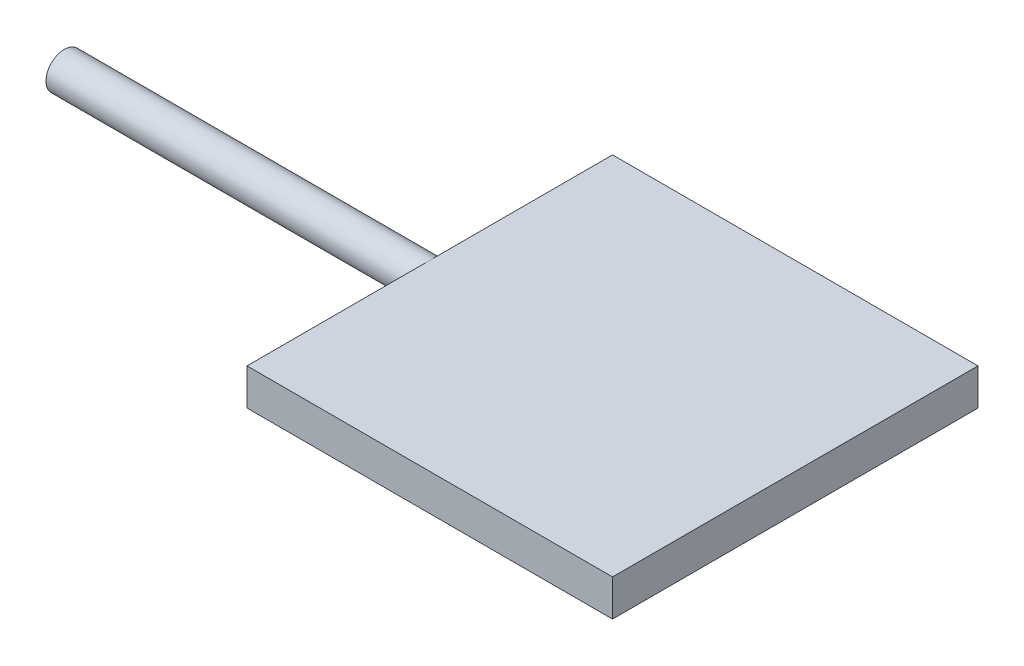
ISO-10303-21;
HEADER;
FILE_DESCRIPTION(('STEP AP214'),'2;1');
FILE_NAME('part.step','',(''),(''),'','','');
FILE_SCHEMA(('AUTOMOTIVE_DESIGN { 1 0 10303 214 1 1 1 1 }'));
ENDSEC;
DATA;
#1=APPLICATION_CONTEXT('core data for automotive mechanical design processes');
#2=APPLICATION_PROTOCOL_DEFINITION('international standard','automotive_design',2000,#1);
#3=PRODUCT_CONTEXT('',#1,'mechanical');
#4=PRODUCT('Part','Part','',(#3));
#5=PRODUCT_RELATED_PRODUCT_CATEGORY('part','',(#4));
#6=PRODUCT_DEFINITION_FORMATION('','',#4);
#7=PRODUCT_DEFINITION_CONTEXT('part definition',#1,'design');
#8=PRODUCT_DEFINITION('design','',#6,#7);
#9=PRODUCT_DEFINITION_SHAPE('','',#8);
#10=(LENGTH_UNIT() NAMED_UNIT(*) SI_UNIT(.MILLI.,.METRE.));
#11=(NAMED_UNIT(*) PLANE_ANGLE_UNIT() SI_UNIT($,.RADIAN.));
#12=(NAMED_UNIT(*) SI_UNIT($,.STERADIAN.) SOLID_ANGLE_UNIT());
#13=UNCERTAINTY_MEASURE_WITH_UNIT(LENGTH_MEASURE(1.E-05),#10,'distance_accuracy_value','');
#14=(GEOMETRIC_REPRESENTATION_CONTEXT(3) GLOBAL_UNCERTAINTY_ASSIGNED_CONTEXT((#13)) GLOBAL_UNIT_ASSIGNED_CONTEXT((#10,
#11,#12)) REPRESENTATION_CONTEXT('',''));
#15=CARTESIAN_POINT('',(0.,0.,0.));
#16=DIRECTION('',(0.,0.,1.));
#17=DIRECTION('',(1.,0.,0.));
#18=AXIS2_PLACEMENT_3D('',#15,#16,#17);
#19=CARTESIAN_POINT('',(0.,10.,0.));
#20=DIRECTION('',(1.,0.,0.));
#21=DIRECTION('',(0.,0.,-1.));
#22=AXIS2_PLACEMENT_3D('',#19,#20,#21);
#23=PLANE('',#22);
#24=CARTESIAN_POINT('',(0.,5.,-50.));
#25=DIRECTION('',(-1.,0.,0.));
#26=DIRECTION('',(0.,0.,1.));
#27=AXIS2_PLACEMENT_3D('',#24,#25,#26);
#28=CIRCLE('',#27,5.);
#29=CARTESIAN_POINT('',(0.,10.,-50.));
#30=VERTEX_POINT('',#29);
#31=CARTESIAN_POINT('',(0.,0.,-50.));
#32=VERTEX_POINT('',#31);
#33=EDGE_CURVE('E43',#30,#32,#28,.T.);
#34=ORIENTED_EDGE('',*,*,#33,.F.);
#35=DIRECTION('',(0.,0.,1.));
#36=VECTOR('',#35,1.);
#37=CARTESIAN_POINT('',(0.,10.,0.));
#38=LINE('',#37,#36);
#39=CARTESIAN_POINT('',(0.,10.,-100.));
#40=VERTEX_POINT('',#39);
#41=EDGE_CURVE('E86',#40,#30,#38,.T.);
#42=ORIENTED_EDGE('',*,*,#41,.F.);
#43=DIRECTION('',(0.,-1.,0.));
#44=VECTOR('',#43,1.);
#45=CARTESIAN_POINT('',(0.,10.,-100.));
#46=LINE('',#45,#44);
#47=CARTESIAN_POINT('',(0.,0.,-100.));
#48=VERTEX_POINT('',#47);
#49=EDGE_CURVE('E197',#40,#48,#46,.T.);
#50=ORIENTED_EDGE('',*,*,#49,.T.);
#51=DIRECTION('',(0.,0.,1.));
#52=VECTOR('',#51,1.);
#53=CARTESIAN_POINT('',(0.,0.,0.));
#54=LINE('',#53,#52);
#55=EDGE_CURVE('E97',#48,#32,#54,.T.);
#56=ORIENTED_EDGE('',*,*,#55,.T.);
#57=EDGE_LOOP('',(#34,#42,#50,#56));
#58=FACE_BOUND('',#57,.T.);
#59=ADVANCED_FACE('F33',(#58),#23,.F.);
#60=EDGE_CURVE('E11',#32,#30,#28,.T.);
#61=ORIENTED_EDGE('',*,*,#60,.F.);
#62=CARTESIAN_POINT('',(0.,0.,0.));
#63=VERTEX_POINT('',#62);
#64=EDGE_CURVE('E202',#32,#63,#54,.T.);
#65=ORIENTED_EDGE('',*,*,#64,.T.);
#66=DIRECTION('',(0.,-1.,0.));
#67=VECTOR('',#66,1.);
#68=CARTESIAN_POINT('',(0.,10.,0.));
#69=LINE('',#68,#67);
#70=CARTESIAN_POINT('',(0.,10.,0.));
#71=VERTEX_POINT('',#70);
#72=EDGE_CURVE('E37',#71,#63,#69,.T.);
#73=ORIENTED_EDGE('',*,*,#72,.F.);
#74=EDGE_CURVE('E82',#30,#71,#38,.T.);
#75=ORIENTED_EDGE('',*,*,#74,.F.);
#76=EDGE_LOOP('',(#61,#65,#73,#75));
#77=FACE_BOUND('',#76,.T.);
#78=ADVANCED_FACE('F35',(#77),#23,.F.);
#79=CARTESIAN_POINT('',(0.,10.,0.));
#80=DIRECTION('',(0.,0.,-1.));
#81=DIRECTION('',(-1.,0.,0.));
#82=AXIS2_PLACEMENT_3D('',#79,#80,#81);
#83=PLANE('',#82);
#84=DIRECTION('',(1.,0.,0.));
#85=VECTOR('',#84,1.);
#86=CARTESIAN_POINT('',(0.,0.,0.));
#87=LINE('',#86,#85);
#88=CARTESIAN_POINT('',(100.,0.,0.));
#89=VERTEX_POINT('',#88);
#90=EDGE_CURVE('E183',#63,#89,#87,.T.);
#91=ORIENTED_EDGE('',*,*,#90,.T.);
#92=DIRECTION('',(0.,-1.,0.));
#93=VECTOR('',#92,1.);
#94=CARTESIAN_POINT('',(100.,10.,0.));
#95=LINE('',#94,#93);
#96=CARTESIAN_POINT('',(100.,10.,0.));
#97=VERTEX_POINT('',#96);
#98=EDGE_CURVE('E185',#97,#89,#95,.T.);
#99=ORIENTED_EDGE('',*,*,#98,.F.);
#100=DIRECTION('',(1.,0.,0.));
#101=VECTOR('',#100,1.);
#102=CARTESIAN_POINT('',(0.,10.,0.));
#103=LINE('',#102,#101);
#104=EDGE_CURVE('E90',#71,#97,#103,.T.);
#105=ORIENTED_EDGE('',*,*,#104,.F.);
#106=ORIENTED_EDGE('',*,*,#72,.T.);
#107=EDGE_LOOP('',(#91,#99,#105,#106));
#108=FACE_BOUND('',#107,.T.);
#109=ADVANCED_FACE('F120',(#108),#83,.F.);
#110=CARTESIAN_POINT('',(100.,10.,0.));
#111=DIRECTION('',(-1.,0.,0.));
#112=DIRECTION('',(0.,0.,1.));
#113=AXIS2_PLACEMENT_3D('',#110,#111,#112);
#114=PLANE('',#113);
#115=DIRECTION('',(0.,0.,-1.));
#116=VECTOR('',#115,1.);
#117=CARTESIAN_POINT('',(100.,0.,0.));
#118=LINE('',#117,#116);
#119=CARTESIAN_POINT('',(100.,0.,-100.));
#120=VERTEX_POINT('',#119);
#121=EDGE_CURVE('E188',#89,#120,#118,.T.);
#122=ORIENTED_EDGE('',*,*,#121,.T.);
#123=DIRECTION('',(0.,-1.,0.));
#124=VECTOR('',#123,1.);
#125=CARTESIAN_POINT('',(100.,10.,-100.));
#126=LINE('',#125,#124);
#127=CARTESIAN_POINT('',(100.,10.,-100.));
#128=VERTEX_POINT('',#127);
#129=EDGE_CURVE('E192',#128,#120,#126,.T.);
#130=ORIENTED_EDGE('',*,*,#129,.F.);
#131=DIRECTION('',(0.,0.,-1.));
#132=VECTOR('',#131,1.);
#133=CARTESIAN_POINT('',(100.,10.,0.));
#134=LINE('',#133,#132);
#135=EDGE_CURVE('E191',#97,#128,#134,.T.);
#136=ORIENTED_EDGE('',*,*,#135,.F.);
#137=ORIENTED_EDGE('',*,*,#98,.T.);
#138=EDGE_LOOP('',(#122,#130,#136,#137));
#139=FACE_BOUND('',#138,.T.);
#140=ADVANCED_FACE('F124',(#139),#114,.F.);
#141=CARTESIAN_POINT('',(0.,10.,-100.));
#142=DIRECTION('',(0.,0.,1.));
#143=DIRECTION('',(1.,0.,0.));
#144=AXIS2_PLACEMENT_3D('',#141,#142,#143);
#145=PLANE('',#144);
#146=DIRECTION('',(-1.,0.,0.));
#147=VECTOR('',#146,1.);
#148=CARTESIAN_POINT('',(0.,0.,-100.));
#149=LINE('',#148,#147);
#150=EDGE_CURVE('E77',#120,#48,#149,.T.);
#151=ORIENTED_EDGE('',*,*,#150,.T.);
#152=ORIENTED_EDGE('',*,*,#49,.F.);
#153=DIRECTION('',(-1.,0.,0.));
#154=VECTOR('',#153,1.);
#155=CARTESIAN_POINT('',(0.,10.,-100.));
#156=LINE('',#155,#154);
#157=EDGE_CURVE('E57',#128,#40,#156,.T.);
#158=ORIENTED_EDGE('',*,*,#157,.F.);
#159=ORIENTED_EDGE('',*,*,#129,.T.);
#160=EDGE_LOOP('',(#151,#152,#158,#159));
#161=FACE_BOUND('',#160,.T.);
#162=ADVANCED_FACE('F129',(#161),#145,.F.);
#163=CARTESIAN_POINT('',(0.,10.,0.));
#164=DIRECTION('',(0.,-1.,0.));
#165=DIRECTION('',(0.,0.,-1.));
#166=AXIS2_PLACEMENT_3D('',#163,#164,#165);
#167=PLANE('',#166);
#168=ORIENTED_EDGE('',*,*,#41,.T.);
#169=ORIENTED_EDGE('',*,*,#74,.T.);
#170=ORIENTED_EDGE('',*,*,#104,.T.);
#171=ORIENTED_EDGE('',*,*,#135,.T.);
#172=ORIENTED_EDGE('',*,*,#157,.T.);
#173=EDGE_LOOP('',(#168,#169,#170,#171,#172));
#174=FACE_BOUND('',#173,.T.);
#175=ADVANCED_FACE('F87',(#174),#167,.F.);
#176=CARTESIAN_POINT('',(0.,0.,0.));
#177=DIRECTION('',(0.,-1.,0.));
#178=DIRECTION('',(0.,0.,-1.));
#179=AXIS2_PLACEMENT_3D('',#176,#177,#178);
#180=PLANE('',#179);
#181=ORIENTED_EDGE('',*,*,#55,.F.);
#182=ORIENTED_EDGE('',*,*,#150,.F.);
#183=ORIENTED_EDGE('',*,*,#121,.F.);
#184=ORIENTED_EDGE('',*,*,#90,.F.);
#185=ORIENTED_EDGE('',*,*,#64,.F.);
#186=EDGE_LOOP('',(#181,#182,#183,#184,#185));
#187=FACE_BOUND('',#186,.T.);
#188=ADVANCED_FACE('F103',(#187),#180,.T.);
#189=CARTESIAN_POINT('',(-100.,5.,-50.));
#190=DIRECTION('',(1.,0.,0.));
#191=DIRECTION('',(0.,0.,-1.));
#192=AXIS2_PLACEMENT_3D('',#189,#190,#191);
#193=CYLINDRICAL_SURFACE('',#192,5.);
#194=CARTESIAN_POINT('',(-100.,5.,-50.));
#195=DIRECTION('',(-1.,0.,0.));
#196=DIRECTION('',(0.,0.,1.));
#197=AXIS2_PLACEMENT_3D('',#194,#195,#196);
#198=CIRCLE('',#197,5.);
#199=CARTESIAN_POINT('',(-100.,5.,-45.));
#200=VERTEX_POINT('',#199);
#201=EDGE_CURVE('E99',#200,#200,#198,.T.);
#202=ORIENTED_EDGE('',*,*,#201,.F.);
#203=EDGE_LOOP('',(#202));
#204=FACE_BOUND('',#203,.T.);
#205=ORIENTED_EDGE('',*,*,#33,.T.);
#206=ORIENTED_EDGE('',*,*,#60,.T.);
#207=EDGE_LOOP('',(#205,#206));
#208=FACE_BOUND('',#207,.T.);
#209=ADVANCED_FACE('F100',(#204,#208),#193,.T.);
#210=CARTESIAN_POINT('',(-100.,5.,-50.));
#211=DIRECTION('',(-1.,0.,0.));
#212=DIRECTION('',(0.,0.,1.));
#213=AXIS2_PLACEMENT_3D('',#210,#211,#212);
#214=PLANE('',#213);
#215=ORIENTED_EDGE('',*,*,#201,.T.);
#216=EDGE_LOOP('',(#215));
#217=FACE_BOUND('',#216,.T.);
#218=ADVANCED_FACE('F102',(#217),#214,.T.);
#219=CLOSED_SHELL('',(#59,#78,#109,#140,#162,#175,#188,#209,#218));
#220=MANIFOLD_SOLID_BREP('B2',#219);
#221=ADVANCED_BREP_SHAPE_REPRESENTATION('',(#18,#220),#14);
#222=SHAPE_DEFINITION_REPRESENTATION(#9,#221);
ENDSEC;
END-ISO-10303-21;
